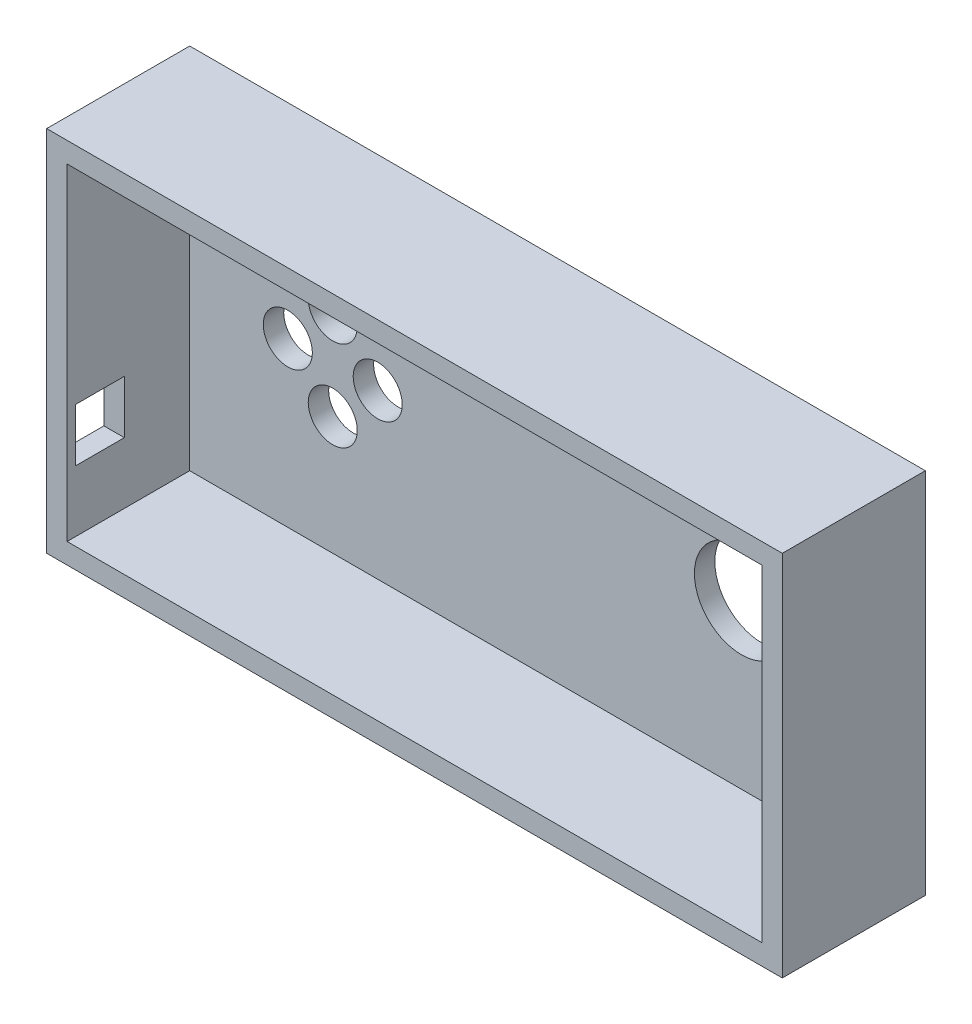
ISO-10303-21;
HEADER;
FILE_DESCRIPTION(('STEP AP214'),'2;1');
FILE_NAME('part.step','',(''),(''),'','','');
FILE_SCHEMA(('AUTOMOTIVE_DESIGN { 1 0 10303 214 1 1 1 1 }'));
ENDSEC;
DATA;
#1=APPLICATION_CONTEXT('core data for automotive mechanical design processes');
#2=APPLICATION_PROTOCOL_DEFINITION('international standard','automotive_design',2000,#1);
#3=PRODUCT_CONTEXT('',#1,'mechanical');
#4=PRODUCT('Part','Part','',(#3));
#5=PRODUCT_RELATED_PRODUCT_CATEGORY('part','',(#4));
#6=PRODUCT_DEFINITION_FORMATION('','',#4);
#7=PRODUCT_DEFINITION_CONTEXT('part definition',#1,'design');
#8=PRODUCT_DEFINITION('design','',#6,#7);
#9=PRODUCT_DEFINITION_SHAPE('','',#8);
#10=(LENGTH_UNIT() NAMED_UNIT(*) SI_UNIT(.MILLI.,.METRE.));
#11=(NAMED_UNIT(*) PLANE_ANGLE_UNIT() SI_UNIT($,.RADIAN.));
#12=(NAMED_UNIT(*) SI_UNIT($,.STERADIAN.) SOLID_ANGLE_UNIT());
#13=UNCERTAINTY_MEASURE_WITH_UNIT(LENGTH_MEASURE(1.E-05),#10,'distance_accuracy_value','');
#14=(GEOMETRIC_REPRESENTATION_CONTEXT(3) GLOBAL_UNCERTAINTY_ASSIGNED_CONTEXT((#13)) GLOBAL_UNIT_ASSIGNED_CONTEXT((#10,
#11,#12)) REPRESENTATION_CONTEXT('',''));
#15=CARTESIAN_POINT('',(0.,0.,0.));
#16=DIRECTION('',(0.,0.,1.));
#17=DIRECTION('',(1.,0.,0.));
#18=AXIS2_PLACEMENT_3D('',#15,#16,#17);
#19=CARTESIAN_POINT('',(0.,0.,5.));
#20=DIRECTION('',(1.,0.,0.));
#21=DIRECTION('',(0.,0.,-1.));
#22=AXIS2_PLACEMENT_3D('',#19,#20,#21);
#23=PLANE('',#22);
#24=DIRECTION('',(0.,1.,0.));
#25=VECTOR('',#24,1.);
#26=CARTESIAN_POINT('',(0.,20.,33.));
#27=LINE('',#26,#25);
#28=CARTESIAN_POINT('',(0.,20.,33.));
#29=VERTEX_POINT('',#28);
#30=CARTESIAN_POINT('',(0.,33.,33.));
#31=VERTEX_POINT('',#30);
#32=EDGE_CURVE('E162',#29,#31,#27,.T.);
#33=ORIENTED_EDGE('',*,*,#32,.F.);
#34=DIRECTION('',(0.,0.,1.));
#35=VECTOR('',#34,1.);
#36=CARTESIAN_POINT('',(0.,20.,21.));
#37=LINE('',#36,#35);
#38=CARTESIAN_POINT('',(0.,20.,21.));
#39=VERTEX_POINT('',#38);
#40=EDGE_CURVE('E152',#39,#29,#37,.T.);
#41=ORIENTED_EDGE('',*,*,#40,.F.);
#42=DIRECTION('',(0.,-1.,0.));
#43=VECTOR('',#42,1.);
#44=CARTESIAN_POINT('',(0.,20.,21.));
#45=LINE('',#44,#43);
#46=CARTESIAN_POINT('',(0.,33.,21.));
#47=VERTEX_POINT('',#46);
#48=EDGE_CURVE('E166',#47,#39,#45,.T.);
#49=ORIENTED_EDGE('',*,*,#48,.F.);
#50=DIRECTION('',(0.,0.,-1.));
#51=VECTOR('',#50,1.);
#52=CARTESIAN_POINT('',(0.,33.,21.));
#53=LINE('',#52,#51);
#54=EDGE_CURVE('E60',#31,#47,#53,.T.);
#55=ORIENTED_EDGE('',*,*,#54,.F.);
#56=EDGE_LOOP('',(#33,#41,#49,#55));
#57=FACE_BOUND('',#56,.T.);
#58=DIRECTION('',(0.,-1.,0.));
#59=VECTOR('',#58,1.);
#60=CARTESIAN_POINT('',(0.,0.,0.));
#61=LINE('',#60,#59);
#62=CARTESIAN_POINT('',(0.,90.,0.));
#63=VERTEX_POINT('',#62);
#64=CARTESIAN_POINT('',(0.,0.,0.));
#65=VERTEX_POINT('',#64);
#66=EDGE_CURVE('E281',#63,#65,#61,.T.);
#67=ORIENTED_EDGE('',*,*,#66,.T.);
#68=DIRECTION('',(0.,0.,-1.));
#69=VECTOR('',#68,1.);
#70=CARTESIAN_POINT('',(0.,0.,5.));
#71=LINE('',#70,#69);
#72=CARTESIAN_POINT('',(0.,0.,35.));
#73=VERTEX_POINT('',#72);
#74=EDGE_CURVE('E11',#73,#65,#71,.T.);
#75=ORIENTED_EDGE('',*,*,#74,.F.);
#76=DIRECTION('',(0.,-1.,0.));
#77=VECTOR('',#76,1.);
#78=CARTESIAN_POINT('',(0.,0.,35.));
#79=LINE('',#78,#77);
#80=CARTESIAN_POINT('',(0.,90.,35.));
#81=VERTEX_POINT('',#80);
#82=EDGE_CURVE('E242',#81,#73,#79,.T.);
#83=ORIENTED_EDGE('',*,*,#82,.F.);
#84=DIRECTION('',(0.,0.,-1.));
#85=VECTOR('',#84,1.);
#86=CARTESIAN_POINT('',(0.,90.,5.));
#87=LINE('',#86,#85);
#88=EDGE_CURVE('E294',#81,#63,#87,.T.);
#89=ORIENTED_EDGE('',*,*,#88,.T.);
#90=EDGE_LOOP('',(#67,#75,#83,#89));
#91=FACE_BOUND('',#90,.T.);
#92=ADVANCED_FACE('F45',(#57,#91),#23,.F.);
#93=CARTESIAN_POINT('',(0.,0.,5.));
#94=DIRECTION('',(0.,1.,0.));
#95=DIRECTION('',(0.,0.,1.));
#96=AXIS2_PLACEMENT_3D('',#93,#94,#95);
#97=PLANE('',#96);
#98=DIRECTION('',(1.,0.,0.));
#99=VECTOR('',#98,1.);
#100=CARTESIAN_POINT('',(0.,0.,0.));
#101=LINE('',#100,#99);
#102=CARTESIAN_POINT('',(180.,0.,0.));
#103=VERTEX_POINT('',#102);
#104=EDGE_CURVE('E285',#65,#103,#101,.T.);
#105=ORIENTED_EDGE('',*,*,#104,.T.);
#106=DIRECTION('',(0.,0.,-1.));
#107=VECTOR('',#106,1.);
#108=CARTESIAN_POINT('',(180.,0.,5.));
#109=LINE('',#108,#107);
#110=CARTESIAN_POINT('',(180.,0.,35.));
#111=VERTEX_POINT('',#110);
#112=EDGE_CURVE('E53',#111,#103,#109,.T.);
#113=ORIENTED_EDGE('',*,*,#112,.F.);
#114=DIRECTION('',(1.,0.,0.));
#115=VECTOR('',#114,1.);
#116=CARTESIAN_POINT('',(0.,0.,35.));
#117=LINE('',#116,#115);
#118=EDGE_CURVE('E246',#73,#111,#117,.T.);
#119=ORIENTED_EDGE('',*,*,#118,.F.);
#120=ORIENTED_EDGE('',*,*,#74,.T.);
#121=EDGE_LOOP('',(#105,#113,#119,#120));
#122=FACE_BOUND('',#121,.T.);
#123=ADVANCED_FACE('F320',(#122),#97,.F.);
#124=CARTESIAN_POINT('',(180.,0.,5.));
#125=DIRECTION('',(-1.,0.,0.));
#126=DIRECTION('',(0.,0.,1.));
#127=AXIS2_PLACEMENT_3D('',#124,#125,#126);
#128=PLANE('',#127);
#129=DIRECTION('',(0.,1.,0.));
#130=VECTOR('',#129,1.);
#131=CARTESIAN_POINT('',(180.,0.,0.));
#132=LINE('',#131,#130);
#133=CARTESIAN_POINT('',(180.,90.,0.));
#134=VERTEX_POINT('',#133);
#135=EDGE_CURVE('E288',#103,#134,#132,.T.);
#136=ORIENTED_EDGE('',*,*,#135,.T.);
#137=DIRECTION('',(0.,0.,-1.));
#138=VECTOR('',#137,1.);
#139=CARTESIAN_POINT('',(180.,90.,5.));
#140=LINE('',#139,#138);
#141=CARTESIAN_POINT('',(180.,90.,35.));
#142=VERTEX_POINT('',#141);
#143=EDGE_CURVE('E298',#142,#134,#140,.T.);
#144=ORIENTED_EDGE('',*,*,#143,.F.);
#145=DIRECTION('',(0.,1.,0.));
#146=VECTOR('',#145,1.);
#147=CARTESIAN_POINT('',(180.,0.,35.));
#148=LINE('',#147,#146);
#149=EDGE_CURVE('E250',#111,#142,#148,.T.);
#150=ORIENTED_EDGE('',*,*,#149,.F.);
#151=ORIENTED_EDGE('',*,*,#112,.T.);
#152=EDGE_LOOP('',(#136,#144,#150,#151));
#153=FACE_BOUND('',#152,.T.);
#154=ADVANCED_FACE('F306',(#153),#128,.F.);
#155=CARTESIAN_POINT('',(0.,90.,5.));
#156=DIRECTION('',(0.,-1.,0.));
#157=DIRECTION('',(0.,0.,-1.));
#158=AXIS2_PLACEMENT_3D('',#155,#156,#157);
#159=PLANE('',#158);
#160=DIRECTION('',(-1.,0.,0.));
#161=VECTOR('',#160,1.);
#162=CARTESIAN_POINT('',(0.,90.,0.));
#163=LINE('',#162,#161);
#164=EDGE_CURVE('E291',#134,#63,#163,.T.);
#165=ORIENTED_EDGE('',*,*,#164,.T.);
#166=ORIENTED_EDGE('',*,*,#88,.F.);
#167=DIRECTION('',(-1.,0.,0.));
#168=VECTOR('',#167,1.);
#169=CARTESIAN_POINT('',(0.,90.,35.));
#170=LINE('',#169,#168);
#171=EDGE_CURVE('E238',#142,#81,#170,.T.);
#172=ORIENTED_EDGE('',*,*,#171,.F.);
#173=ORIENTED_EDGE('',*,*,#143,.T.);
#174=EDGE_LOOP('',(#165,#166,#172,#173));
#175=FACE_BOUND('',#174,.T.);
#176=ADVANCED_FACE('F314',(#175),#159,.F.);
#177=CARTESIAN_POINT('',(0.,0.,0.));
#178=DIRECTION('',(0.,0.,-1.));
#179=DIRECTION('',(-1.,0.,0.));
#180=AXIS2_PLACEMENT_3D('',#177,#178,#179);
#181=PLANE('',#180);
#182=CARTESIAN_POINT('',(140.,45.,0.));
#183=DIRECTION('',(0.,0.,-1.));
#184=DIRECTION('',(-1.,0.,0.));
#185=AXIS2_PLACEMENT_3D('',#182,#183,#184);
#186=CIRCLE('',#185,11.5);
#187=CARTESIAN_POINT('',(128.5,45.,0.));
#188=VERTEX_POINT('',#187);
#189=EDGE_CURVE('E181',#188,#188,#186,.T.);
#190=ORIENTED_EDGE('',*,*,#189,.F.);
#191=EDGE_LOOP('',(#190));
#192=FACE_BOUND('',#191,.T.);
#193=CARTESIAN_POINT('',(40.,34.,0.));
#194=DIRECTION('',(0.,0.,-1.));
#195=DIRECTION('',(-1.,0.,0.));
#196=AXIS2_PLACEMENT_3D('',#193,#194,#195);
#197=CIRCLE('',#196,6.00000000000001);
#198=CARTESIAN_POINT('',(34.,34.,0.));
#199=VERTEX_POINT('',#198);
#200=EDGE_CURVE('E202',#199,#199,#197,.T.);
#201=ORIENTED_EDGE('',*,*,#200,.F.);
#202=EDGE_LOOP('',(#201));
#203=FACE_BOUND('',#202,.T.);
#204=CARTESIAN_POINT('',(29.,45.,0.));
#205=DIRECTION('',(0.,0.,-1.));
#206=DIRECTION('',(-1.,0.,0.));
#207=AXIS2_PLACEMENT_3D('',#204,#205,#206);
#208=CIRCLE('',#207,5.99999999999999);
#209=CARTESIAN_POINT('',(23.,45.,0.));
#210=VERTEX_POINT('',#209);
#211=EDGE_CURVE('E194',#210,#210,#208,.T.);
#212=ORIENTED_EDGE('',*,*,#211,.F.);
#213=EDGE_LOOP('',(#212));
#214=FACE_BOUND('',#213,.T.);
#215=CARTESIAN_POINT('',(40.,56.,0.));
#216=DIRECTION('',(0.,0.,-1.));
#217=DIRECTION('',(-1.,0.,0.));
#218=AXIS2_PLACEMENT_3D('',#215,#216,#217);
#219=CIRCLE('',#218,5.99999999999999);
#220=CARTESIAN_POINT('',(34.,56.,0.));
#221=VERTEX_POINT('',#220);
#222=EDGE_CURVE('E186',#221,#221,#219,.T.);
#223=ORIENTED_EDGE('',*,*,#222,.F.);
#224=EDGE_LOOP('',(#223));
#225=FACE_BOUND('',#224,.T.);
#226=CARTESIAN_POINT('',(51.,45.,0.));
#227=DIRECTION('',(0.,0.,-1.));
#228=DIRECTION('',(-1.,0.,0.));
#229=AXIS2_PLACEMENT_3D('',#226,#227,#228);
#230=CIRCLE('',#229,6.);
#231=CARTESIAN_POINT('',(45.,45.,0.));
#232=VERTEX_POINT('',#231);
#233=EDGE_CURVE('E210',#232,#232,#230,.T.);
#234=ORIENTED_EDGE('',*,*,#233,.F.);
#235=EDGE_LOOP('',(#234));
#236=FACE_BOUND('',#235,.T.);
#237=ORIENTED_EDGE('',*,*,#66,.F.);
#238=ORIENTED_EDGE('',*,*,#164,.F.);
#239=ORIENTED_EDGE('',*,*,#135,.F.);
#240=ORIENTED_EDGE('',*,*,#104,.F.);
#241=EDGE_LOOP('',(#237,#238,#239,#240));
#242=FACE_BOUND('',#241,.T.);
#243=ADVANCED_FACE('F312',(#192,#203,#214,#225,#236,#242),#181,.T.);
#244=CARTESIAN_POINT('',(0.,85.,35.));
#245=DIRECTION('',(0.,-1.,0.));
#246=DIRECTION('',(0.,0.,-1.));
#247=AXIS2_PLACEMENT_3D('',#244,#245,#246);
#248=PLANE('',#247);
#249=DIRECTION('',(-1.,0.,0.));
#250=VECTOR('',#249,1.);
#251=CARTESIAN_POINT('',(0.,85.,5.));
#252=LINE('',#251,#250);
#253=CARTESIAN_POINT('',(175.,85.,5.));
#254=VERTEX_POINT('',#253);
#255=CARTESIAN_POINT('',(5.,85.,5.));
#256=VERTEX_POINT('',#255);
#257=EDGE_CURVE('E190',#254,#256,#252,.T.);
#258=ORIENTED_EDGE('',*,*,#257,.F.);
#259=DIRECTION('',(0.,0.,-1.));
#260=VECTOR('',#259,1.);
#261=CARTESIAN_POINT('',(175.,85.,35.));
#262=LINE('',#261,#260);
#263=CARTESIAN_POINT('',(175.,85.,35.));
#264=VERTEX_POINT('',#263);
#265=EDGE_CURVE('E278',#264,#254,#262,.T.);
#266=ORIENTED_EDGE('',*,*,#265,.F.);
#267=DIRECTION('',(-1.,0.,0.));
#268=VECTOR('',#267,1.);
#269=CARTESIAN_POINT('',(0.,85.,35.));
#270=LINE('',#269,#268);
#271=CARTESIAN_POINT('',(5.,85.,35.));
#272=VERTEX_POINT('',#271);
#273=EDGE_CURVE('E221',#264,#272,#270,.T.);
#274=ORIENTED_EDGE('',*,*,#273,.T.);
#275=DIRECTION('',(0.,0.,-1.));
#276=VECTOR('',#275,1.);
#277=CARTESIAN_POINT('',(5.,85.,35.));
#278=LINE('',#277,#276);
#279=EDGE_CURVE('E254',#272,#256,#278,.T.);
#280=ORIENTED_EDGE('',*,*,#279,.T.);
#281=EDGE_LOOP('',(#258,#266,#274,#280));
#282=FACE_BOUND('',#281,.T.);
#283=ADVANCED_FACE('F333',(#282),#248,.T.);
#284=CARTESIAN_POINT('',(175.,0.,35.));
#285=DIRECTION('',(-1.,0.,0.));
#286=DIRECTION('',(0.,0.,1.));
#287=AXIS2_PLACEMENT_3D('',#284,#285,#286);
#288=PLANE('',#287);
#289=DIRECTION('',(0.,1.,0.));
#290=VECTOR('',#289,1.);
#291=CARTESIAN_POINT('',(175.,0.,5.));
#292=LINE('',#291,#290);
#293=CARTESIAN_POINT('',(175.,5.,5.));
#294=VERTEX_POINT('',#293);
#295=EDGE_CURVE('E258',#294,#254,#292,.T.);
#296=ORIENTED_EDGE('',*,*,#295,.F.);
#297=DIRECTION('',(0.,0.,-1.));
#298=VECTOR('',#297,1.);
#299=CARTESIAN_POINT('',(175.,5.,35.));
#300=LINE('',#299,#298);
#301=CARTESIAN_POINT('',(175.,5.,35.));
#302=VERTEX_POINT('',#301);
#303=EDGE_CURVE('E275',#302,#294,#300,.T.);
#304=ORIENTED_EDGE('',*,*,#303,.F.);
#305=DIRECTION('',(0.,1.,0.));
#306=VECTOR('',#305,1.);
#307=CARTESIAN_POINT('',(175.,0.,35.));
#308=LINE('',#307,#306);
#309=EDGE_CURVE('E225',#302,#264,#308,.T.);
#310=ORIENTED_EDGE('',*,*,#309,.T.);
#311=ORIENTED_EDGE('',*,*,#265,.T.);
#312=EDGE_LOOP('',(#296,#304,#310,#311));
#313=FACE_BOUND('',#312,.T.);
#314=ADVANCED_FACE('F342',(#313),#288,.T.);
#315=CARTESIAN_POINT('',(0.,5.,35.));
#316=DIRECTION('',(0.,1.,0.));
#317=DIRECTION('',(0.,0.,1.));
#318=AXIS2_PLACEMENT_3D('',#315,#316,#317);
#319=PLANE('',#318);
#320=DIRECTION('',(1.,0.,0.));
#321=VECTOR('',#320,1.);
#322=CARTESIAN_POINT('',(0.,5.,5.));
#323=LINE('',#322,#321);
#324=CARTESIAN_POINT('',(5.,5.,5.));
#325=VERTEX_POINT('',#324);
#326=EDGE_CURVE('E262',#325,#294,#323,.T.);
#327=ORIENTED_EDGE('',*,*,#326,.F.);
#328=DIRECTION('',(0.,0.,-1.));
#329=VECTOR('',#328,1.);
#330=CARTESIAN_POINT('',(5.,5.,35.));
#331=LINE('',#330,#329);
#332=CARTESIAN_POINT('',(5.,5.,35.));
#333=VERTEX_POINT('',#332);
#334=EDGE_CURVE('E271',#333,#325,#331,.T.);
#335=ORIENTED_EDGE('',*,*,#334,.F.);
#336=DIRECTION('',(1.,0.,0.));
#337=VECTOR('',#336,1.);
#338=CARTESIAN_POINT('',(0.,5.,35.));
#339=LINE('',#338,#337);
#340=EDGE_CURVE('E230',#333,#302,#339,.T.);
#341=ORIENTED_EDGE('',*,*,#340,.T.);
#342=ORIENTED_EDGE('',*,*,#303,.T.);
#343=EDGE_LOOP('',(#327,#335,#341,#342));
#344=FACE_BOUND('',#343,.T.);
#345=ADVANCED_FACE('F346',(#344),#319,.T.);
#346=CARTESIAN_POINT('',(5.,0.,35.));
#347=DIRECTION('',(1.,0.,0.));
#348=DIRECTION('',(0.,0.,-1.));
#349=AXIS2_PLACEMENT_3D('',#346,#347,#348);
#350=PLANE('',#349);
#351=DIRECTION('',(0.,0.,1.));
#352=VECTOR('',#351,1.);
#353=CARTESIAN_POINT('',(5.,20.,21.));
#354=LINE('',#353,#352);
#355=CARTESIAN_POINT('',(5.,20.,21.));
#356=VERTEX_POINT('',#355);
#357=CARTESIAN_POINT('',(5.,20.,33.));
#358=VERTEX_POINT('',#357);
#359=EDGE_CURVE('E149',#356,#358,#354,.T.);
#360=ORIENTED_EDGE('',*,*,#359,.T.);
#361=DIRECTION('',(0.,1.,0.));
#362=VECTOR('',#361,1.);
#363=CARTESIAN_POINT('',(5.,20.,33.));
#364=LINE('',#363,#362);
#365=CARTESIAN_POINT('',(5.,33.,33.));
#366=VERTEX_POINT('',#365);
#367=EDGE_CURVE('E135',#358,#366,#364,.T.);
#368=ORIENTED_EDGE('',*,*,#367,.T.);
#369=DIRECTION('',(0.,0.,-1.));
#370=VECTOR('',#369,1.);
#371=CARTESIAN_POINT('',(5.,33.,21.));
#372=LINE('',#371,#370);
#373=CARTESIAN_POINT('',(5.,33.,21.));
#374=VERTEX_POINT('',#373);
#375=EDGE_CURVE('E171',#366,#374,#372,.T.);
#376=ORIENTED_EDGE('',*,*,#375,.T.);
#377=DIRECTION('',(0.,-1.,0.));
#378=VECTOR('',#377,1.);
#379=CARTESIAN_POINT('',(5.,20.,21.));
#380=LINE('',#379,#378);
#381=EDGE_CURVE('E158',#374,#356,#380,.T.);
#382=ORIENTED_EDGE('',*,*,#381,.T.);
#383=EDGE_LOOP('',(#360,#368,#376,#382));
#384=FACE_BOUND('',#383,.T.);
#385=DIRECTION('',(0.,-1.,0.));
#386=VECTOR('',#385,1.);
#387=CARTESIAN_POINT('',(5.,0.,5.));
#388=LINE('',#387,#386);
#389=EDGE_CURVE('E226',#256,#325,#388,.T.);
#390=ORIENTED_EDGE('',*,*,#389,.F.);
#391=ORIENTED_EDGE('',*,*,#279,.F.);
#392=DIRECTION('',(0.,-1.,0.));
#393=VECTOR('',#392,1.);
#394=CARTESIAN_POINT('',(5.,0.,35.));
#395=LINE('',#394,#393);
#396=EDGE_CURVE('E234',#272,#333,#395,.T.);
#397=ORIENTED_EDGE('',*,*,#396,.T.);
#398=ORIENTED_EDGE('',*,*,#334,.T.);
#399=EDGE_LOOP('',(#390,#391,#397,#398));
#400=FACE_BOUND('',#399,.T.);
#401=ADVANCED_FACE('F156',(#384,#400),#350,.T.);
#402=CARTESIAN_POINT('',(0.,0.,35.));
#403=DIRECTION('',(0.,0.,1.));
#404=DIRECTION('',(1.,0.,0.));
#405=AXIS2_PLACEMENT_3D('',#402,#403,#404);
#406=PLANE('',#405);
#407=ORIENTED_EDGE('',*,*,#273,.F.);
#408=ORIENTED_EDGE('',*,*,#309,.F.);
#409=ORIENTED_EDGE('',*,*,#340,.F.);
#410=ORIENTED_EDGE('',*,*,#396,.F.);
#411=EDGE_LOOP('',(#407,#408,#409,#410));
#412=FACE_BOUND('',#411,.T.);
#413=ORIENTED_EDGE('',*,*,#171,.T.);
#414=ORIENTED_EDGE('',*,*,#82,.T.);
#415=ORIENTED_EDGE('',*,*,#118,.T.);
#416=ORIENTED_EDGE('',*,*,#149,.T.);
#417=EDGE_LOOP('',(#413,#414,#415,#416));
#418=FACE_BOUND('',#417,.T.);
#419=ADVANCED_FACE('F319',(#412,#418),#406,.T.);
#420=CARTESIAN_POINT('',(0.,0.,5.));
#421=DIRECTION('',(0.,0.,-1.));
#422=DIRECTION('',(-1.,0.,0.));
#423=AXIS2_PLACEMENT_3D('',#420,#421,#422);
#424=PLANE('',#423);
#425=CARTESIAN_POINT('',(140.,45.,5.));
#426=DIRECTION('',(0.,0.,-1.));
#427=DIRECTION('',(-1.,0.,0.));
#428=AXIS2_PLACEMENT_3D('',#425,#426,#427);
#429=CIRCLE('',#428,11.5);
#430=CARTESIAN_POINT('',(128.5,45.,5.));
#431=VERTEX_POINT('',#430);
#432=EDGE_CURVE('E185',#431,#431,#429,.F.);
#433=ORIENTED_EDGE('',*,*,#432,.F.);
#434=EDGE_LOOP('',(#433));
#435=FACE_BOUND('',#434,.T.);
#436=CARTESIAN_POINT('',(40.,34.,5.));
#437=DIRECTION('',(0.,0.,-1.));
#438=DIRECTION('',(-1.,0.,0.));
#439=AXIS2_PLACEMENT_3D('',#436,#437,#438);
#440=CIRCLE('',#439,6.00000000000001);
#441=CARTESIAN_POINT('',(34.,34.,5.));
#442=VERTEX_POINT('',#441);
#443=EDGE_CURVE('E198',#442,#442,#440,.F.);
#444=ORIENTED_EDGE('',*,*,#443,.F.);
#445=EDGE_LOOP('',(#444));
#446=FACE_BOUND('',#445,.T.);
#447=CARTESIAN_POINT('',(29.,45.,5.));
#448=DIRECTION('',(0.,0.,-1.));
#449=DIRECTION('',(-1.,0.,0.));
#450=AXIS2_PLACEMENT_3D('',#447,#448,#449);
#451=CIRCLE('',#450,5.99999999999999);
#452=CARTESIAN_POINT('',(23.,45.,5.));
#453=VERTEX_POINT('',#452);
#454=EDGE_CURVE('E180',#453,#453,#451,.F.);
#455=ORIENTED_EDGE('',*,*,#454,.F.);
#456=EDGE_LOOP('',(#455));
#457=FACE_BOUND('',#456,.T.);
#458=CARTESIAN_POINT('',(40.,56.,5.));
#459=DIRECTION('',(0.,0.,-1.));
#460=DIRECTION('',(-1.,0.,0.));
#461=AXIS2_PLACEMENT_3D('',#458,#459,#460);
#462=CIRCLE('',#461,5.99999999999999);
#463=CARTESIAN_POINT('',(34.,56.,5.));
#464=VERTEX_POINT('',#463);
#465=EDGE_CURVE('E214',#464,#464,#462,.F.);
#466=ORIENTED_EDGE('',*,*,#465,.F.);
#467=EDGE_LOOP('',(#466));
#468=FACE_BOUND('',#467,.T.);
#469=CARTESIAN_POINT('',(51.,45.,5.));
#470=DIRECTION('',(0.,0.,-1.));
#471=DIRECTION('',(-1.,0.,0.));
#472=AXIS2_PLACEMENT_3D('',#469,#470,#471);
#473=CIRCLE('',#472,6.);
#474=CARTESIAN_POINT('',(45.,45.,5.));
#475=VERTEX_POINT('',#474);
#476=EDGE_CURVE('E206',#475,#475,#473,.F.);
#477=ORIENTED_EDGE('',*,*,#476,.F.);
#478=EDGE_LOOP('',(#477));
#479=FACE_BOUND('',#478,.T.);
#480=ORIENTED_EDGE('',*,*,#295,.T.);
#481=ORIENTED_EDGE('',*,*,#257,.T.);
#482=ORIENTED_EDGE('',*,*,#389,.T.);
#483=ORIENTED_EDGE('',*,*,#326,.T.);
#484=EDGE_LOOP('',(#480,#481,#482,#483));
#485=FACE_BOUND('',#484,.T.);
#486=ADVANCED_FACE('F335',(#435,#446,#457,#468,#479,#485),#424,.F.);
#487=CARTESIAN_POINT('',(51.,45.,37.5269119345812));
#488=DIRECTION('',(0.,0.,-1.));
#489=DIRECTION('',(-1.,0.,0.));
#490=AXIS2_PLACEMENT_3D('',#487,#488,#489);
#491=CYLINDRICAL_SURFACE('',#490,6.);
#492=ORIENTED_EDGE('',*,*,#476,.T.);
#493=EDGE_LOOP('',(#492));
#494=FACE_BOUND('',#493,.T.);
#495=ORIENTED_EDGE('',*,*,#233,.T.);
#496=EDGE_LOOP('',(#495));
#497=FACE_BOUND('',#496,.T.);
#498=ADVANCED_FACE('F338',(#494,#497),#491,.F.);
#499=CARTESIAN_POINT('',(40.,56.,37.5269119345812));
#500=DIRECTION('',(0.,0.,-1.));
#501=DIRECTION('',(-1.,0.,0.));
#502=AXIS2_PLACEMENT_3D('',#499,#500,#501);
#503=CYLINDRICAL_SURFACE('',#502,5.99999999999999);
#504=ORIENTED_EDGE('',*,*,#465,.T.);
#505=EDGE_LOOP('',(#504));
#506=FACE_BOUND('',#505,.T.);
#507=ORIENTED_EDGE('',*,*,#222,.T.);
#508=EDGE_LOOP('',(#507));
#509=FACE_BOUND('',#508,.T.);
#510=ADVANCED_FACE('F356',(#506,#509),#503,.F.);
#511=CARTESIAN_POINT('',(29.,45.,37.5269119345812));
#512=DIRECTION('',(0.,0.,-1.));
#513=DIRECTION('',(-1.,0.,0.));
#514=AXIS2_PLACEMENT_3D('',#511,#512,#513);
#515=CYLINDRICAL_SURFACE('',#514,5.99999999999999);
#516=ORIENTED_EDGE('',*,*,#454,.T.);
#517=EDGE_LOOP('',(#516));
#518=FACE_BOUND('',#517,.T.);
#519=ORIENTED_EDGE('',*,*,#211,.T.);
#520=EDGE_LOOP('',(#519));
#521=FACE_BOUND('',#520,.T.);
#522=ADVANCED_FACE('F359',(#518,#521),#515,.F.);
#523=CARTESIAN_POINT('',(40.,34.,37.5269119345812));
#524=DIRECTION('',(0.,0.,-1.));
#525=DIRECTION('',(-1.,0.,0.));
#526=AXIS2_PLACEMENT_3D('',#523,#524,#525);
#527=CYLINDRICAL_SURFACE('',#526,6.00000000000001);
#528=ORIENTED_EDGE('',*,*,#443,.T.);
#529=EDGE_LOOP('',(#528));
#530=FACE_BOUND('',#529,.T.);
#531=ORIENTED_EDGE('',*,*,#200,.T.);
#532=EDGE_LOOP('',(#531));
#533=FACE_BOUND('',#532,.T.);
#534=ADVANCED_FACE('F364',(#530,#533),#527,.F.);
#535=CARTESIAN_POINT('',(140.,45.,37.5269119345812));
#536=DIRECTION('',(0.,0.,-1.));
#537=DIRECTION('',(-1.,0.,0.));
#538=AXIS2_PLACEMENT_3D('',#535,#536,#537);
#539=CYLINDRICAL_SURFACE('',#538,11.5);
#540=ORIENTED_EDGE('',*,*,#432,.T.);
#541=EDGE_LOOP('',(#540));
#542=FACE_BOUND('',#541,.T.);
#543=ORIENTED_EDGE('',*,*,#189,.T.);
#544=EDGE_LOOP('',(#543));
#545=FACE_BOUND('',#544,.T.);
#546=ADVANCED_FACE('F367',(#542,#545),#539,.F.);
#547=CARTESIAN_POINT('',(22.6918060129541,20.,21.));
#548=DIRECTION('',(0.,-1.,0.));
#549=DIRECTION('',(0.,0.,-1.));
#550=AXIS2_PLACEMENT_3D('',#547,#548,#549);
#551=PLANE('',#550);
#552=DIRECTION('',(-1.,0.,0.));
#553=VECTOR('',#552,1.);
#554=CARTESIAN_POINT('',(22.6918060129541,20.,21.));
#555=LINE('',#554,#553);
#556=EDGE_CURVE('E68',#356,#39,#555,.T.);
#557=ORIENTED_EDGE('',*,*,#556,.T.);
#558=ORIENTED_EDGE('',*,*,#40,.T.);
#559=DIRECTION('',(-1.,0.,0.));
#560=VECTOR('',#559,1.);
#561=CARTESIAN_POINT('',(22.6918060129541,20.,33.));
#562=LINE('',#561,#560);
#563=EDGE_CURVE('E139',#358,#29,#562,.T.);
#564=ORIENTED_EDGE('',*,*,#563,.F.);
#565=ORIENTED_EDGE('',*,*,#359,.F.);
#566=EDGE_LOOP('',(#557,#558,#564,#565));
#567=FACE_BOUND('',#566,.T.);
#568=ADVANCED_FACE('F148',(#567),#551,.F.);
#569=CARTESIAN_POINT('',(22.6918060129541,20.,33.));
#570=DIRECTION('',(0.,0.,1.));
#571=DIRECTION('',(1.,0.,0.));
#572=AXIS2_PLACEMENT_3D('',#569,#570,#571);
#573=PLANE('',#572);
#574=ORIENTED_EDGE('',*,*,#563,.T.);
#575=ORIENTED_EDGE('',*,*,#32,.T.);
#576=DIRECTION('',(-1.,0.,0.));
#577=VECTOR('',#576,1.);
#578=CARTESIAN_POINT('',(22.6918060129541,33.,33.));
#579=LINE('',#578,#577);
#580=EDGE_CURVE('E141',#366,#31,#579,.T.);
#581=ORIENTED_EDGE('',*,*,#580,.F.);
#582=ORIENTED_EDGE('',*,*,#367,.F.);
#583=EDGE_LOOP('',(#574,#575,#581,#582));
#584=FACE_BOUND('',#583,.T.);
#585=ADVANCED_FACE('F137',(#584),#573,.F.);
#586=CARTESIAN_POINT('',(22.6918060129541,33.,21.));
#587=DIRECTION('',(0.,1.,0.));
#588=DIRECTION('',(0.,0.,1.));
#589=AXIS2_PLACEMENT_3D('',#586,#587,#588);
#590=PLANE('',#589);
#591=ORIENTED_EDGE('',*,*,#580,.T.);
#592=ORIENTED_EDGE('',*,*,#54,.T.);
#593=DIRECTION('',(-1.,0.,0.));
#594=VECTOR('',#593,1.);
#595=CARTESIAN_POINT('',(22.6918060129541,33.,21.));
#596=LINE('',#595,#594);
#597=EDGE_CURVE('E170',#374,#47,#596,.T.);
#598=ORIENTED_EDGE('',*,*,#597,.F.);
#599=ORIENTED_EDGE('',*,*,#375,.F.);
#600=EDGE_LOOP('',(#591,#592,#598,#599));
#601=FACE_BOUND('',#600,.T.);
#602=ADVANCED_FACE('F379',(#601),#590,.F.);
#603=CARTESIAN_POINT('',(22.6918060129541,20.,21.));
#604=DIRECTION('',(0.,0.,-1.));
#605=DIRECTION('',(0.,1.,0.));
#606=AXIS2_PLACEMENT_3D('',#603,#604,#605);
#607=PLANE('',#606);
#608=ORIENTED_EDGE('',*,*,#597,.T.);
#609=ORIENTED_EDGE('',*,*,#48,.T.);
#610=ORIENTED_EDGE('',*,*,#556,.F.);
#611=ORIENTED_EDGE('',*,*,#381,.F.);
#612=EDGE_LOOP('',(#608,#609,#610,#611));
#613=FACE_BOUND('',#612,.T.);
#614=ADVANCED_FACE('F382',(#613),#607,.F.);
#615=CLOSED_SHELL('',(#92,#123,#154,#176,#243,#283,#314,#345,#401,#419,#486,#498,#510,#522,#534,
#546,#568,#585,#602,#614));
#616=MANIFOLD_SOLID_BREP('B2',#615);
#617=ADVANCED_BREP_SHAPE_REPRESENTATION('',(#18,#616),#14);
#618=SHAPE_DEFINITION_REPRESENTATION(#9,#617);
ENDSEC;
END-ISO-10303-21;
